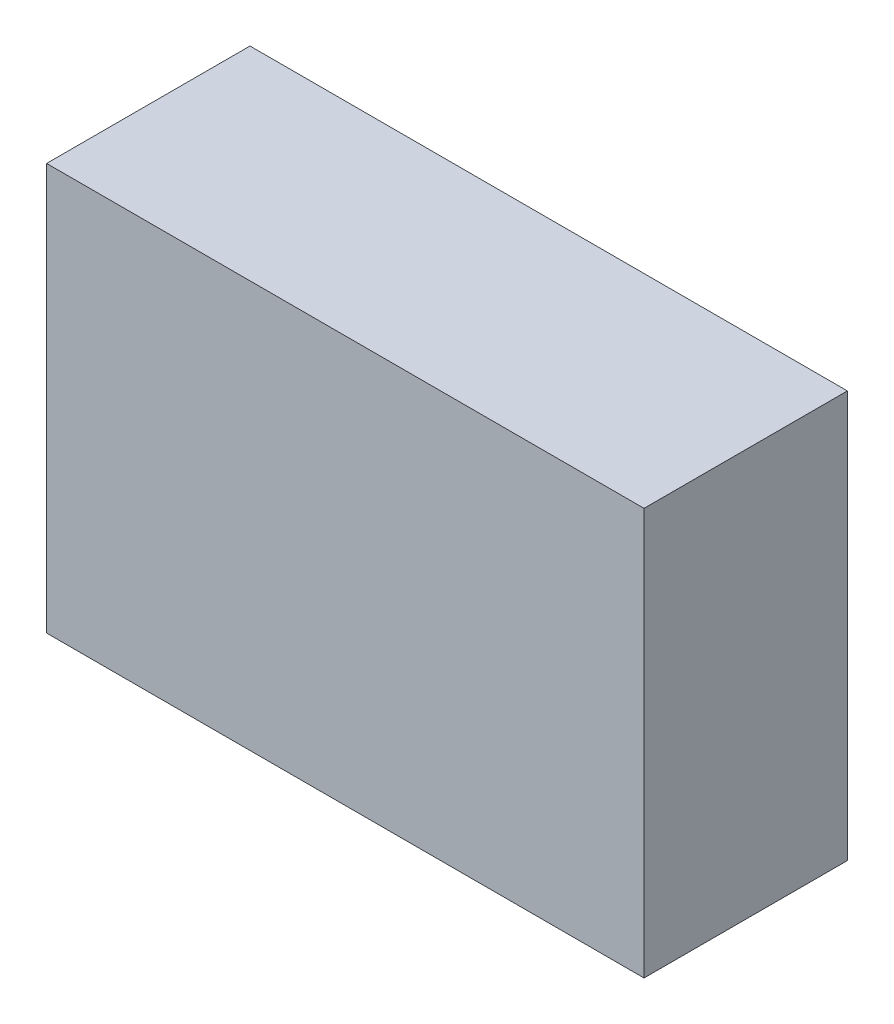
ISO-10303-21;
HEADER;
FILE_DESCRIPTION(('STEP AP214'),'2;1');
FILE_NAME('part.step','',(''),(''),'','','');
FILE_SCHEMA(('AUTOMOTIVE_DESIGN { 1 0 10303 214 1 1 1 1 }'));
ENDSEC;
DATA;
#1=APPLICATION_CONTEXT('core data for automotive mechanical design processes');
#2=APPLICATION_PROTOCOL_DEFINITION('international standard','automotive_design',2000,#1);
#3=PRODUCT_CONTEXT('',#1,'mechanical');
#4=PRODUCT('Part','Part','',(#3));
#5=PRODUCT_RELATED_PRODUCT_CATEGORY('part','',(#4));
#6=PRODUCT_DEFINITION_FORMATION('','',#4);
#7=PRODUCT_DEFINITION_CONTEXT('part definition',#1,'design');
#8=PRODUCT_DEFINITION('design','',#6,#7);
#9=PRODUCT_DEFINITION_SHAPE('','',#8);
#10=(LENGTH_UNIT() NAMED_UNIT(*) SI_UNIT(.MILLI.,.METRE.));
#11=(NAMED_UNIT(*) PLANE_ANGLE_UNIT() SI_UNIT($,.RADIAN.));
#12=(NAMED_UNIT(*) SI_UNIT($,.STERADIAN.) SOLID_ANGLE_UNIT());
#13=UNCERTAINTY_MEASURE_WITH_UNIT(LENGTH_MEASURE(1.E-05),#10,'distance_accuracy_value','');
#14=(GEOMETRIC_REPRESENTATION_CONTEXT(3) GLOBAL_UNCERTAINTY_ASSIGNED_CONTEXT((#13)) GLOBAL_UNIT_ASSIGNED_CONTEXT((#10,
#11,#12)) REPRESENTATION_CONTEXT('',''));
#15=CARTESIAN_POINT('',(0.,0.,0.));
#16=DIRECTION('',(0.,0.,1.));
#17=DIRECTION('',(1.,0.,0.));
#18=AXIS2_PLACEMENT_3D('',#15,#16,#17);
#19=CARTESIAN_POINT('',(-47.,32.,32.));
#20=DIRECTION('',(1.,0.,0.));
#21=DIRECTION('',(0.,1.,0.));
#22=AXIS2_PLACEMENT_3D('',#19,#20,#21);
#23=PLANE('',#22);
#24=DIRECTION('',(0.,-1.,0.));
#25=VECTOR('',#24,1.);
#26=CARTESIAN_POINT('',(-47.,32.,0.));
#27=LINE('',#26,#25);
#28=CARTESIAN_POINT('',(-47.,32.,0.));
#29=VERTEX_POINT('',#28);
#30=CARTESIAN_POINT('',(-47.,-32.,0.));
#31=VERTEX_POINT('',#30);
#32=EDGE_CURVE('E97',#29,#31,#27,.T.);
#33=ORIENTED_EDGE('',*,*,#32,.T.);
#34=DIRECTION('',(0.,0.,-1.));
#35=VECTOR('',#34,1.);
#36=CARTESIAN_POINT('',(-47.,-32.,32.));
#37=LINE('',#36,#35);
#38=CARTESIAN_POINT('',(-47.,-32.,32.));
#39=VERTEX_POINT('',#38);
#40=EDGE_CURVE('E11',#39,#31,#37,.T.);
#41=ORIENTED_EDGE('',*,*,#40,.F.);
#42=DIRECTION('',(0.,-1.,0.));
#43=VECTOR('',#42,1.);
#44=CARTESIAN_POINT('',(-47.,32.,32.));
#45=LINE('',#44,#43);
#46=CARTESIAN_POINT('',(-47.,32.,32.));
#47=VERTEX_POINT('',#46);
#48=EDGE_CURVE('E85',#47,#39,#45,.T.);
#49=ORIENTED_EDGE('',*,*,#48,.F.);
#50=DIRECTION('',(0.,0.,-1.));
#51=VECTOR('',#50,1.);
#52=CARTESIAN_POINT('',(-47.,32.,32.));
#53=LINE('',#52,#51);
#54=EDGE_CURVE('E93',#47,#29,#53,.T.);
#55=ORIENTED_EDGE('',*,*,#54,.T.);
#56=EDGE_LOOP('',(#33,#41,#49,#55));
#57=FACE_BOUND('',#56,.T.);
#58=ADVANCED_FACE('F34',(#57),#23,.F.);
#59=CARTESIAN_POINT('',(47.,-32.,32.));
#60=DIRECTION('',(0.,1.,0.));
#61=DIRECTION('',(-1.,0.,0.));
#62=AXIS2_PLACEMENT_3D('',#59,#60,#61);
#63=PLANE('',#62);
#64=DIRECTION('',(1.,0.,0.));
#65=VECTOR('',#64,1.);
#66=CARTESIAN_POINT('',(47.,-32.,0.));
#67=LINE('',#66,#65);
#68=CARTESIAN_POINT('',(47.,-32.,0.));
#69=VERTEX_POINT('',#68);
#70=EDGE_CURVE('E89',#31,#69,#67,.T.);
#71=ORIENTED_EDGE('',*,*,#70,.T.);
#72=DIRECTION('',(0.,0.,-1.));
#73=VECTOR('',#72,1.);
#74=CARTESIAN_POINT('',(47.,-32.,32.));
#75=LINE('',#74,#73);
#76=CARTESIAN_POINT('',(47.,-32.,32.));
#77=VERTEX_POINT('',#76);
#78=EDGE_CURVE('E42',#77,#69,#75,.T.);
#79=ORIENTED_EDGE('',*,*,#78,.F.);
#80=DIRECTION('',(1.,0.,0.));
#81=VECTOR('',#80,1.);
#82=CARTESIAN_POINT('',(47.,-32.,32.));
#83=LINE('',#82,#81);
#84=EDGE_CURVE('E80',#39,#77,#83,.T.);
#85=ORIENTED_EDGE('',*,*,#84,.F.);
#86=ORIENTED_EDGE('',*,*,#40,.T.);
#87=EDGE_LOOP('',(#71,#79,#85,#86));
#88=FACE_BOUND('',#87,.T.);
#89=ADVANCED_FACE('F88',(#88),#63,.F.);
#90=CARTESIAN_POINT('',(47.,32.,32.));
#91=DIRECTION('',(-1.,0.,0.));
#92=DIRECTION('',(0.,-1.,0.));
#93=AXIS2_PLACEMENT_3D('',#90,#91,#92);
#94=PLANE('',#93);
#95=DIRECTION('',(0.,1.,0.));
#96=VECTOR('',#95,1.);
#97=CARTESIAN_POINT('',(47.,32.,0.));
#98=LINE('',#97,#96);
#99=CARTESIAN_POINT('',(47.,32.,0.));
#100=VERTEX_POINT('',#99);
#101=EDGE_CURVE('E67',#69,#100,#98,.T.);
#102=ORIENTED_EDGE('',*,*,#101,.T.);
#103=DIRECTION('',(0.,0.,-1.));
#104=VECTOR('',#103,1.);
#105=CARTESIAN_POINT('',(47.,32.,32.));
#106=LINE('',#105,#104);
#107=CARTESIAN_POINT('',(47.,32.,32.));
#108=VERTEX_POINT('',#107);
#109=EDGE_CURVE('E90',#108,#100,#106,.T.);
#110=ORIENTED_EDGE('',*,*,#109,.F.);
#111=DIRECTION('',(0.,1.,0.));
#112=VECTOR('',#111,1.);
#113=CARTESIAN_POINT('',(47.,32.,32.));
#114=LINE('',#113,#112);
#115=EDGE_CURVE('E83',#77,#108,#114,.T.);
#116=ORIENTED_EDGE('',*,*,#115,.F.);
#117=ORIENTED_EDGE('',*,*,#78,.T.);
#118=EDGE_LOOP('',(#102,#110,#116,#117));
#119=FACE_BOUND('',#118,.T.);
#120=ADVANCED_FACE('F91',(#119),#94,.F.);
#121=CARTESIAN_POINT('',(47.,32.,32.));
#122=DIRECTION('',(0.,-1.,0.));
#123=DIRECTION('',(1.,0.,0.));
#124=AXIS2_PLACEMENT_3D('',#121,#122,#123);
#125=PLANE('',#124);
#126=DIRECTION('',(-1.,0.,0.));
#127=VECTOR('',#126,1.);
#128=CARTESIAN_POINT('',(47.,32.,0.));
#129=LINE('',#128,#127);
#130=EDGE_CURVE('E73',#100,#29,#129,.T.);
#131=ORIENTED_EDGE('',*,*,#130,.T.);
#132=ORIENTED_EDGE('',*,*,#54,.F.);
#133=DIRECTION('',(-1.,0.,0.));
#134=VECTOR('',#133,1.);
#135=CARTESIAN_POINT('',(47.,32.,32.));
#136=LINE('',#135,#134);
#137=EDGE_CURVE('E50',#108,#47,#136,.T.);
#138=ORIENTED_EDGE('',*,*,#137,.F.);
#139=ORIENTED_EDGE('',*,*,#109,.T.);
#140=EDGE_LOOP('',(#131,#132,#138,#139));
#141=FACE_BOUND('',#140,.T.);
#142=ADVANCED_FACE('F104',(#141),#125,.F.);
#143=CARTESIAN_POINT('',(0.,0.,32.));
#144=DIRECTION('',(0.,0.,-1.));
#145=DIRECTION('',(-1.,0.,0.));
#146=AXIS2_PLACEMENT_3D('',#143,#144,#145);
#147=PLANE('',#146);
#148=ORIENTED_EDGE('',*,*,#48,.T.);
#149=ORIENTED_EDGE('',*,*,#84,.T.);
#150=ORIENTED_EDGE('',*,*,#115,.T.);
#151=ORIENTED_EDGE('',*,*,#137,.T.);
#152=EDGE_LOOP('',(#148,#149,#150,#151));
#153=FACE_BOUND('',#152,.T.);
#154=ADVANCED_FACE('F81',(#153),#147,.F.);
#155=CARTESIAN_POINT('',(0.,0.,0.));
#156=DIRECTION('',(0.,0.,-1.));
#157=DIRECTION('',(-1.,0.,0.));
#158=AXIS2_PLACEMENT_3D('',#155,#156,#157);
#159=PLANE('',#158);
#160=ORIENTED_EDGE('',*,*,#32,.F.);
#161=ORIENTED_EDGE('',*,*,#130,.F.);
#162=ORIENTED_EDGE('',*,*,#101,.F.);
#163=ORIENTED_EDGE('',*,*,#70,.F.);
#164=EDGE_LOOP('',(#160,#161,#162,#163));
#165=FACE_BOUND('',#164,.T.);
#166=ADVANCED_FACE('F107',(#165),#159,.T.);
#167=CLOSED_SHELL('',(#58,#89,#120,#142,#154,#166));
#168=MANIFOLD_SOLID_BREP('B2',#167);
#169=ADVANCED_BREP_SHAPE_REPRESENTATION('',(#18,#168),#14);
#170=SHAPE_DEFINITION_REPRESENTATION(#9,#169);
ENDSEC;
END-ISO-10303-21;
